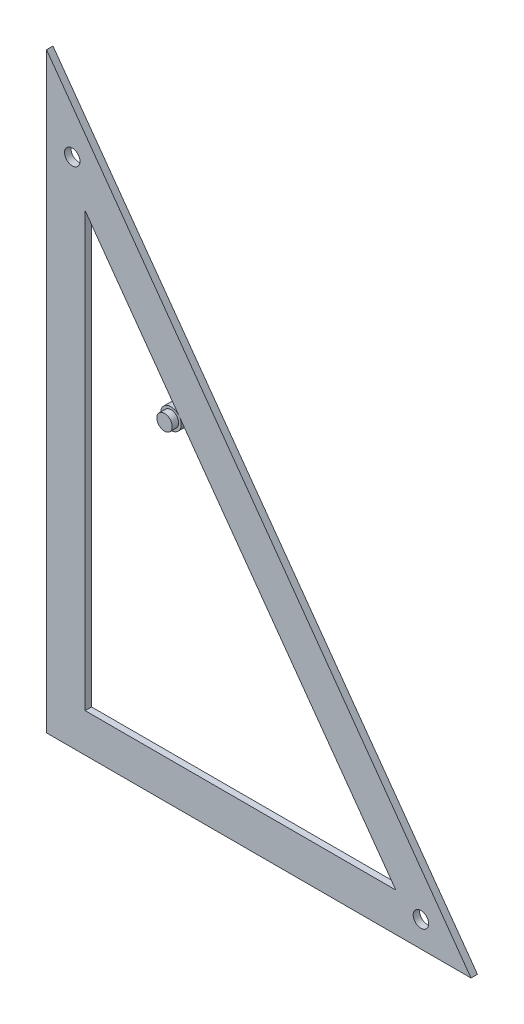
ISO-10303-21;
HEADER;
FILE_DESCRIPTION(('STEP AP214'),'2;1');
FILE_NAME('part.step','',(''),(''),'','','');
FILE_SCHEMA(('AUTOMOTIVE_DESIGN { 1 0 10303 214 1 1 1 1 }'));
ENDSEC;
DATA;
#1=APPLICATION_CONTEXT('core data for automotive mechanical design processes');
#2=APPLICATION_PROTOCOL_DEFINITION('international standard','automotive_design',2000,#1);
#3=PRODUCT_CONTEXT('',#1,'mechanical');
#4=PRODUCT('Part','Part','',(#3));
#5=PRODUCT_RELATED_PRODUCT_CATEGORY('part','',(#4));
#6=PRODUCT_DEFINITION_FORMATION('','',#4);
#7=PRODUCT_DEFINITION_CONTEXT('part definition',#1,'design');
#8=PRODUCT_DEFINITION('design','',#6,#7);
#9=PRODUCT_DEFINITION_SHAPE('','',#8);
#10=(LENGTH_UNIT() NAMED_UNIT(*) SI_UNIT(.MILLI.,.METRE.));
#11=(NAMED_UNIT(*) PLANE_ANGLE_UNIT() SI_UNIT($,.RADIAN.));
#12=(NAMED_UNIT(*) SI_UNIT($,.STERADIAN.) SOLID_ANGLE_UNIT());
#13=UNCERTAINTY_MEASURE_WITH_UNIT(LENGTH_MEASURE(1.E-05),#10,'distance_accuracy_value','');
#14=(GEOMETRIC_REPRESENTATION_CONTEXT(3) GLOBAL_UNCERTAINTY_ASSIGNED_CONTEXT((#13)) GLOBAL_UNIT_ASSIGNED_CONTEXT((#10,
#11,#12)) REPRESENTATION_CONTEXT('',''));
#15=CARTESIAN_POINT('',(0.,0.,0.));
#16=DIRECTION('',(0.,0.,1.));
#17=DIRECTION('',(1.,0.,0.));
#18=AXIS2_PLACEMENT_3D('',#15,#16,#17);
#19=CARTESIAN_POINT('',(96.7112317844096,260.,2.5));
#20=DIRECTION('',(0.,0.,-1.));
#21=DIRECTION('',(-1.,0.,0.));
#22=AXIS2_PLACEMENT_3D('',#19,#20,#21);
#23=CYLINDRICAL_SURFACE('',#22,8.00000000000001);
#24=CARTESIAN_POINT('',(96.7112317844096,260.,2.5));
#25=DIRECTION('',(0.,0.,1.));
#26=DIRECTION('',(1.,0.,0.));
#27=AXIS2_PLACEMENT_3D('',#24,#25,#26);
#28=CIRCLE('',#27,8.00000000000001);
#29=CARTESIAN_POINT('',(104.71123178441,260.,2.5));
#30=VERTEX_POINT('',#29);
#31=EDGE_CURVE('E49',#30,#30,#28,.T.);
#32=ORIENTED_EDGE('',*,*,#31,.F.);
#33=EDGE_LOOP('',(#32));
#34=FACE_BOUND('',#33,.T.);
#35=CARTESIAN_POINT('',(96.7112317844096,260.,-2.5));
#36=DIRECTION('',(0.,0.,1.));
#37=DIRECTION('',(1.,0.,0.));
#38=AXIS2_PLACEMENT_3D('',#35,#36,#37);
#39=CIRCLE('',#38,8.00000000000001);
#40=CARTESIAN_POINT('',(104.71123178441,260.,-2.5));
#41=VERTEX_POINT('',#40);
#42=EDGE_CURVE('E53',#41,#41,#39,.T.);
#43=ORIENTED_EDGE('',*,*,#42,.T.);
#44=EDGE_LOOP('',(#43));
#45=FACE_BOUND('',#44,.T.);
#46=ADVANCED_FACE('F43',(#34,#45),#23,.T.);
#47=CARTESIAN_POINT('',(96.7112317844096,260.,2.5));
#48=DIRECTION('',(0.,0.,1.));
#49=DIRECTION('',(1.,0.,0.));
#50=AXIS2_PLACEMENT_3D('',#47,#48,#49);
#51=PLANE('',#50);
#52=CARTESIAN_POINT('',(96.7112317844096,260.,2.5));
#53=DIRECTION('',(0.,0.,1.));
#54=DIRECTION('',(1.,0.,0.));
#55=AXIS2_PLACEMENT_3D('',#52,#53,#54);
#56=CIRCLE('',#55,6.);
#57=CARTESIAN_POINT('',(102.71123178441,260.,2.5));
#58=VERTEX_POINT('',#57);
#59=EDGE_CURVE('E58',#58,#58,#56,.F.);
#60=ORIENTED_EDGE('',*,*,#59,.T.);
#61=EDGE_LOOP('',(#60));
#62=FACE_BOUND('',#61,.T.);
#63=ORIENTED_EDGE('',*,*,#31,.T.);
#64=EDGE_LOOP('',(#63));
#65=FACE_BOUND('',#64,.T.);
#66=ADVANCED_FACE('F87',(#62,#65),#51,.T.);
#67=CARTESIAN_POINT('',(96.7112317844096,260.,-2.5));
#68=DIRECTION('',(0.,0.,1.));
#69=DIRECTION('',(1.,0.,0.));
#70=AXIS2_PLACEMENT_3D('',#67,#68,#69);
#71=PLANE('',#70);
#72=CARTESIAN_POINT('',(96.7112317844096,260.,-2.5));
#73=DIRECTION('',(0.,0.,1.));
#74=DIRECTION('',(1.,0.,0.));
#75=AXIS2_PLACEMENT_3D('',#72,#73,#74);
#76=CIRCLE('',#75,6.);
#77=CARTESIAN_POINT('',(102.71123178441,260.,-2.5));
#78=VERTEX_POINT('',#77);
#79=EDGE_CURVE('E11',#78,#78,#76,.F.);
#80=ORIENTED_EDGE('',*,*,#79,.F.);
#81=EDGE_LOOP('',(#80));
#82=FACE_BOUND('',#81,.T.);
#83=ORIENTED_EDGE('',*,*,#42,.F.);
#84=EDGE_LOOP('',(#83));
#85=FACE_BOUND('',#84,.T.);
#86=ADVANCED_FACE('F92',(#82,#85),#71,.F.);
#87=CARTESIAN_POINT('',(96.7112317844096,260.,-7.5));
#88=DIRECTION('',(0.,0.,1.));
#89=DIRECTION('',(1.,0.,0.));
#90=AXIS2_PLACEMENT_3D('',#87,#88,#89);
#91=PLANE('',#90);
#92=CARTESIAN_POINT('',(96.7112317844096,260.,-7.5));
#93=DIRECTION('',(0.,0.,1.));
#94=DIRECTION('',(1.,0.,0.));
#95=AXIS2_PLACEMENT_3D('',#92,#93,#94);
#96=CIRCLE('',#95,6.);
#97=CARTESIAN_POINT('',(102.71123178441,260.,-7.5));
#98=VERTEX_POINT('',#97);
#99=EDGE_CURVE('E63',#98,#98,#96,.T.);
#100=ORIENTED_EDGE('',*,*,#99,.F.);
#101=EDGE_LOOP('',(#100));
#102=FACE_BOUND('',#101,.T.);
#103=ADVANCED_FACE('F81',(#102),#91,.F.);
#104=CARTESIAN_POINT('',(96.7112317844096,260.,7.5));
#105=DIRECTION('',(0.,0.,-1.));
#106=DIRECTION('',(-1.,0.,0.));
#107=AXIS2_PLACEMENT_3D('',#104,#105,#106);
#108=CYLINDRICAL_SURFACE('',#107,6.);
#109=ORIENTED_EDGE('',*,*,#99,.T.);
#110=EDGE_LOOP('',(#109));
#111=FACE_BOUND('',#110,.T.);
#112=ORIENTED_EDGE('',*,*,#79,.T.);
#113=EDGE_LOOP('',(#112));
#114=FACE_BOUND('',#113,.T.);
#115=ADVANCED_FACE('F73',(#111,#114),#108,.T.);
#116=ORIENTED_EDGE('',*,*,#59,.F.);
#117=EDGE_LOOP('',(#116));
#118=FACE_BOUND('',#117,.T.);
#119=CARTESIAN_POINT('',(96.7112317844096,260.,7.5));
#120=DIRECTION('',(0.,0.,1.));
#121=DIRECTION('',(1.,0.,0.));
#122=AXIS2_PLACEMENT_3D('',#119,#120,#121);
#123=CIRCLE('',#122,6.);
#124=CARTESIAN_POINT('',(102.71123178441,260.,7.5));
#125=VERTEX_POINT('',#124);
#126=EDGE_CURVE('E62',#125,#125,#123,.T.);
#127=ORIENTED_EDGE('',*,*,#126,.F.);
#128=EDGE_LOOP('',(#127));
#129=FACE_BOUND('',#128,.T.);
#130=ADVANCED_FACE('F71',(#118,#129),#108,.T.);
#131=CARTESIAN_POINT('',(96.7112317844096,260.,7.5));
#132=DIRECTION('',(0.,0.,1.));
#133=DIRECTION('',(1.,0.,0.));
#134=AXIS2_PLACEMENT_3D('',#131,#132,#133);
#135=PLANE('',#134);
#136=ORIENTED_EDGE('',*,*,#126,.T.);
#137=EDGE_LOOP('',(#136));
#138=FACE_BOUND('',#137,.T.);
#139=ADVANCED_FACE('F69',(#138),#135,.T.);
#140=CLOSED_SHELL('',(#46,#66,#86,#103,#115,#130,#139));
#141=MANIFOLD_SOLID_BREP('B2',#140);
#142=CARTESIAN_POINT('',(0.,0.,2.5));
#143=DIRECTION('',(0.,0.,-1.));
#144=DIRECTION('',(-1.,0.,0.));
#145=AXIS2_PLACEMENT_3D('',#142,#143,#144);
#146=PLANE('',#145);
#147=DIRECTION('',(1.,0.,0.));
#148=VECTOR('',#147,1.);
#149=CARTESIAN_POINT('',(330.,0.,2.5));
#150=LINE('',#149,#148);
#151=CARTESIAN_POINT('',(0.,0.,2.5));
#152=VERTEX_POINT('',#151);
#153=CARTESIAN_POINT('',(330.,0.,2.5));
#154=VERTEX_POINT('',#153);
#155=EDGE_CURVE('E226',#152,#154,#150,.T.);
#156=ORIENTED_EDGE('',*,*,#155,.T.);
#157=DIRECTION('',(-0.582907875451731,0.812538250629685,0.));
#158=VECTOR('',#157,1.);
#159=CARTESIAN_POINT('',(0.,460.,2.5));
#160=LINE('',#159,#158);
#161=CARTESIAN_POINT('',(0.,460.,2.5));
#162=VERTEX_POINT('',#161);
#163=EDGE_CURVE('E229',#154,#162,#160,.T.);
#164=ORIENTED_EDGE('',*,*,#163,.T.);
#165=DIRECTION('',(0.,-1.,0.));
#166=VECTOR('',#165,1.);
#167=CARTESIAN_POINT('',(0.,0.,2.5));
#168=LINE('',#167,#166);
#169=EDGE_CURVE('E232',#162,#152,#168,.T.);
#170=ORIENTED_EDGE('',*,*,#169,.T.);
#171=EDGE_LOOP('',(#156,#164,#170));
#172=FACE_BOUND('',#171,.T.);
#173=DIRECTION('',(1.,0.,0.));
#174=VECTOR('',#173,1.);
#175=CARTESIAN_POINT('',(271.556922118127,30.,2.5));
#176=LINE('',#175,#174);
#177=CARTESIAN_POINT('',(30.,30.,2.5));
#178=VERTEX_POINT('',#177);
#179=CARTESIAN_POINT('',(271.556922118127,30.,2.5));
#180=VERTEX_POINT('',#179);
#181=EDGE_CURVE('E196',#178,#180,#176,.T.);
#182=ORIENTED_EDGE('',*,*,#181,.F.);
#183=DIRECTION('',(0.,-1.,0.));
#184=VECTOR('',#183,1.);
#185=CARTESIAN_POINT('',(30.,30.,2.5));
#186=LINE('',#185,#184);
#187=CARTESIAN_POINT('',(30.,366.715709619207,2.5));
#188=VERTEX_POINT('',#187);
#189=EDGE_CURVE('E214',#188,#178,#186,.T.);
#190=ORIENTED_EDGE('',*,*,#189,.F.);
#191=DIRECTION('',(-0.582907875451731,0.812538250629685,0.));
#192=VECTOR('',#191,1.);
#193=CARTESIAN_POINT('',(30.,366.715709619207,2.5));
#194=LINE('',#193,#192);
#195=EDGE_CURVE('E204',#180,#188,#194,.T.);
#196=ORIENTED_EDGE('',*,*,#195,.F.);
#197=EDGE_LOOP('',(#182,#190,#196));
#198=FACE_BOUND('',#197,.T.);
#199=CARTESIAN_POINT('',(20.,397.810473079471,2.5));
#200=DIRECTION('',(0.,0.,1.));
#201=DIRECTION('',(1.,0.,0.));
#202=AXIS2_PLACEMENT_3D('',#199,#200,#201);
#203=CIRCLE('',#202,6.);
#204=CARTESIAN_POINT('',(26.,397.810473079471,2.5));
#205=VERTEX_POINT('',#204);
#206=EDGE_CURVE('E220',#205,#205,#203,.T.);
#207=ORIENTED_EDGE('',*,*,#206,.F.);
#208=EDGE_LOOP('',(#207));
#209=FACE_BOUND('',#208,.T.);
#210=CARTESIAN_POINT('',(291.037948078751,20.0000000000001,2.5));
#211=DIRECTION('',(0.,0.,1.));
#212=DIRECTION('',(1.,0.,0.));
#213=AXIS2_PLACEMENT_3D('',#210,#211,#212);
#214=CIRCLE('',#213,5.99999999999999);
#215=CARTESIAN_POINT('',(297.037948078751,20.0000000000001,2.5));
#216=VERTEX_POINT('',#215);
#217=EDGE_CURVE('E291',#216,#216,#214,.T.);
#218=ORIENTED_EDGE('',*,*,#217,.F.);
#219=EDGE_LOOP('',(#218));
#220=FACE_BOUND('',#219,.T.);
#221=ADVANCED_FACE('F143',(#172,#198,#209,#220),#146,.F.);
#222=CARTESIAN_POINT('',(0.,0.,-2.5));
#223=DIRECTION('',(0.,0.,-1.));
#224=DIRECTION('',(-1.,0.,0.));
#225=AXIS2_PLACEMENT_3D('',#222,#223,#224);
#226=PLANE('',#225);
#227=CARTESIAN_POINT('',(20.,397.810473079471,-2.5));
#228=DIRECTION('',(0.,0.,1.));
#229=DIRECTION('',(1.,0.,0.));
#230=AXIS2_PLACEMENT_3D('',#227,#228,#229);
#231=CIRCLE('',#230,6.);
#232=CARTESIAN_POINT('',(26.,397.810473079471,-2.5));
#233=VERTEX_POINT('',#232);
#234=EDGE_CURVE('E297',#233,#233,#231,.T.);
#235=ORIENTED_EDGE('',*,*,#234,.T.);
#236=EDGE_LOOP('',(#235));
#237=FACE_BOUND('',#236,.T.);
#238=DIRECTION('',(1.,0.,0.));
#239=VECTOR('',#238,1.);
#240=CARTESIAN_POINT('',(330.,0.,-2.5));
#241=LINE('',#240,#239);
#242=CARTESIAN_POINT('',(0.,0.,-2.5));
#243=VERTEX_POINT('',#242);
#244=CARTESIAN_POINT('',(330.,0.,-2.5));
#245=VERTEX_POINT('',#244);
#246=EDGE_CURVE('E211',#243,#245,#241,.T.);
#247=ORIENTED_EDGE('',*,*,#246,.F.);
#248=DIRECTION('',(0.,-1.,0.));
#249=VECTOR('',#248,1.);
#250=CARTESIAN_POINT('',(0.,0.,-2.5));
#251=LINE('',#250,#249);
#252=CARTESIAN_POINT('',(0.,460.,-2.5));
#253=VERTEX_POINT('',#252);
#254=EDGE_CURVE('E230',#253,#243,#251,.T.);
#255=ORIENTED_EDGE('',*,*,#254,.F.);
#256=DIRECTION('',(-0.582907875451731,0.812538250629685,0.));
#257=VECTOR('',#256,1.);
#258=CARTESIAN_POINT('',(0.,460.,-2.5));
#259=LINE('',#258,#257);
#260=EDGE_CURVE('E237',#245,#253,#259,.T.);
#261=ORIENTED_EDGE('',*,*,#260,.F.);
#262=EDGE_LOOP('',(#247,#255,#261));
#263=FACE_BOUND('',#262,.T.);
#264=DIRECTION('',(0.,-1.,0.));
#265=VECTOR('',#264,1.);
#266=CARTESIAN_POINT('',(30.,30.,-2.5));
#267=LINE('',#266,#265);
#268=CARTESIAN_POINT('',(30.,366.715709619207,-2.5));
#269=VERTEX_POINT('',#268);
#270=CARTESIAN_POINT('',(30.,30.,-2.5));
#271=VERTEX_POINT('',#270);
#272=EDGE_CURVE('E205',#269,#271,#267,.T.);
#273=ORIENTED_EDGE('',*,*,#272,.T.);
#274=DIRECTION('',(1.,0.,0.));
#275=VECTOR('',#274,1.);
#276=CARTESIAN_POINT('',(271.556922118127,30.,-2.5));
#277=LINE('',#276,#275);
#278=CARTESIAN_POINT('',(271.556922118127,30.,-2.5));
#279=VERTEX_POINT('',#278);
#280=EDGE_CURVE('E166',#271,#279,#277,.T.);
#281=ORIENTED_EDGE('',*,*,#280,.T.);
#282=DIRECTION('',(-0.582907875451731,0.812538250629685,0.));
#283=VECTOR('',#282,1.);
#284=CARTESIAN_POINT('',(30.,366.715709619207,-2.5));
#285=LINE('',#284,#283);
#286=EDGE_CURVE('E210',#279,#269,#285,.T.);
#287=ORIENTED_EDGE('',*,*,#286,.T.);
#288=EDGE_LOOP('',(#273,#281,#287));
#289=FACE_BOUND('',#288,.T.);
#290=CARTESIAN_POINT('',(291.037948078751,20.0000000000001,-2.5));
#291=DIRECTION('',(0.,0.,1.));
#292=DIRECTION('',(1.,0.,0.));
#293=AXIS2_PLACEMENT_3D('',#290,#291,#292);
#294=CIRCLE('',#293,5.99999999999999);
#295=CARTESIAN_POINT('',(297.037948078751,20.0000000000001,-2.5));
#296=VERTEX_POINT('',#295);
#297=EDGE_CURVE('E294',#296,#296,#294,.T.);
#298=ORIENTED_EDGE('',*,*,#297,.T.);
#299=EDGE_LOOP('',(#298));
#300=FACE_BOUND('',#299,.T.);
#301=ADVANCED_FACE('F251',(#237,#263,#289,#300),#226,.T.);
#302=CARTESIAN_POINT('',(330.,0.,2.5));
#303=DIRECTION('',(0.,1.,0.));
#304=DIRECTION('',(-1.,0.,0.));
#305=AXIS2_PLACEMENT_3D('',#302,#303,#304);
#306=PLANE('',#305);
#307=ORIENTED_EDGE('',*,*,#246,.T.);
#308=DIRECTION('',(0.,0.,-1.));
#309=VECTOR('',#308,1.);
#310=CARTESIAN_POINT('',(330.,0.,2.5));
#311=LINE('',#310,#309);
#312=EDGE_CURVE('E41',#154,#245,#311,.T.);
#313=ORIENTED_EDGE('',*,*,#312,.F.);
#314=ORIENTED_EDGE('',*,*,#155,.F.);
#315=DIRECTION('',(0.,0.,-1.));
#316=VECTOR('',#315,1.);
#317=CARTESIAN_POINT('',(0.,0.,2.5));
#318=LINE('',#317,#316);
#319=EDGE_CURVE('E234',#152,#243,#318,.T.);
#320=ORIENTED_EDGE('',*,*,#319,.T.);
#321=EDGE_LOOP('',(#307,#313,#314,#320));
#322=FACE_BOUND('',#321,.T.);
#323=ADVANCED_FACE('F145',(#322),#306,.F.);
#324=CARTESIAN_POINT('',(0.,460.,2.5));
#325=DIRECTION('',(-0.812538250629685,-0.582907875451731,0.));
#326=DIRECTION('',(0.582907875451731,-0.812538250629685,0.));
#327=AXIS2_PLACEMENT_3D('',#324,#325,#326);
#328=PLANE('',#327);
#329=ORIENTED_EDGE('',*,*,#260,.T.);
#330=DIRECTION('',(0.,0.,-1.));
#331=VECTOR('',#330,1.);
#332=CARTESIAN_POINT('',(0.,460.,2.5));
#333=LINE('',#332,#331);
#334=EDGE_CURVE('E151',#162,#253,#333,.T.);
#335=ORIENTED_EDGE('',*,*,#334,.F.);
#336=ORIENTED_EDGE('',*,*,#163,.F.);
#337=ORIENTED_EDGE('',*,*,#312,.T.);
#338=EDGE_LOOP('',(#329,#335,#336,#337));
#339=FACE_BOUND('',#338,.T.);
#340=ADVANCED_FACE('F257',(#339),#328,.F.);
#341=CARTESIAN_POINT('',(0.,0.,2.5));
#342=DIRECTION('',(1.,0.,0.));
#343=DIRECTION('',(0.,0.,-1.));
#344=AXIS2_PLACEMENT_3D('',#341,#342,#343);
#345=PLANE('',#344);
#346=ORIENTED_EDGE('',*,*,#254,.T.);
#347=ORIENTED_EDGE('',*,*,#319,.F.);
#348=ORIENTED_EDGE('',*,*,#169,.F.);
#349=ORIENTED_EDGE('',*,*,#334,.T.);
#350=EDGE_LOOP('',(#346,#347,#348,#349));
#351=FACE_BOUND('',#350,.T.);
#352=ADVANCED_FACE('F246',(#351),#345,.F.);
#353=CARTESIAN_POINT('',(271.556922118127,30.,2.5));
#354=DIRECTION('',(0.,1.,0.));
#355=DIRECTION('',(0.,0.,1.));
#356=AXIS2_PLACEMENT_3D('',#353,#354,#355);
#357=PLANE('',#356);
#358=ORIENTED_EDGE('',*,*,#280,.F.);
#359=DIRECTION('',(0.,0.,-1.));
#360=VECTOR('',#359,1.);
#361=CARTESIAN_POINT('',(30.,30.,2.5));
#362=LINE('',#361,#360);
#363=EDGE_CURVE('E200',#178,#271,#362,.T.);
#364=ORIENTED_EDGE('',*,*,#363,.F.);
#365=ORIENTED_EDGE('',*,*,#181,.T.);
#366=DIRECTION('',(0.,0.,-1.));
#367=VECTOR('',#366,1.);
#368=CARTESIAN_POINT('',(271.556922118127,30.,2.5));
#369=LINE('',#368,#367);
#370=EDGE_CURVE('E199',#180,#279,#369,.T.);
#371=ORIENTED_EDGE('',*,*,#370,.T.);
#372=EDGE_LOOP('',(#358,#364,#365,#371));
#373=FACE_BOUND('',#372,.T.);
#374=ADVANCED_FACE('F198',(#373),#357,.T.);
#375=CARTESIAN_POINT('',(30.,366.715709619207,2.5));
#376=DIRECTION('',(-0.812538250629685,-0.582907875451731,0.));
#377=DIRECTION('',(0.582907875451731,-0.812538250629685,0.));
#378=AXIS2_PLACEMENT_3D('',#375,#376,#377);
#379=PLANE('',#378);
#380=ORIENTED_EDGE('',*,*,#286,.F.);
#381=ORIENTED_EDGE('',*,*,#370,.F.);
#382=ORIENTED_EDGE('',*,*,#195,.T.);
#383=DIRECTION('',(0.,0.,-1.));
#384=VECTOR('',#383,1.);
#385=CARTESIAN_POINT('',(30.,366.715709619207,2.5));
#386=LINE('',#385,#384);
#387=EDGE_CURVE('E158',#188,#269,#386,.T.);
#388=ORIENTED_EDGE('',*,*,#387,.T.);
#389=EDGE_LOOP('',(#380,#381,#382,#388));
#390=FACE_BOUND('',#389,.T.);
#391=ADVANCED_FACE('F208',(#390),#379,.T.);
#392=CARTESIAN_POINT('',(30.,30.,2.5));
#393=DIRECTION('',(1.,0.,0.));
#394=DIRECTION('',(0.,1.,0.));
#395=AXIS2_PLACEMENT_3D('',#392,#393,#394);
#396=PLANE('',#395);
#397=ORIENTED_EDGE('',*,*,#272,.F.);
#398=ORIENTED_EDGE('',*,*,#387,.F.);
#399=ORIENTED_EDGE('',*,*,#189,.T.);
#400=ORIENTED_EDGE('',*,*,#363,.T.);
#401=EDGE_LOOP('',(#397,#398,#399,#400));
#402=FACE_BOUND('',#401,.T.);
#403=ADVANCED_FACE('F276',(#402),#396,.T.);
#404=CARTESIAN_POINT('',(20.,397.810473079471,2.5));
#405=DIRECTION('',(0.,0.,-1.));
#406=DIRECTION('',(-1.,0.,0.));
#407=AXIS2_PLACEMENT_3D('',#404,#405,#406);
#408=CYLINDRICAL_SURFACE('',#407,6.);
#409=ORIENTED_EDGE('',*,*,#206,.T.);
#410=EDGE_LOOP('',(#409));
#411=FACE_BOUND('',#410,.T.);
#412=ORIENTED_EDGE('',*,*,#234,.F.);
#413=EDGE_LOOP('',(#412));
#414=FACE_BOUND('',#413,.T.);
#415=ADVANCED_FACE('F279',(#411,#414),#408,.F.);
#416=CARTESIAN_POINT('',(291.037948078751,20.0000000000001,2.5));
#417=DIRECTION('',(0.,0.,-1.));
#418=DIRECTION('',(-1.,0.,0.));
#419=AXIS2_PLACEMENT_3D('',#416,#417,#418);
#420=CYLINDRICAL_SURFACE('',#419,5.99999999999999);
#421=ORIENTED_EDGE('',*,*,#217,.T.);
#422=EDGE_LOOP('',(#421));
#423=FACE_BOUND('',#422,.T.);
#424=ORIENTED_EDGE('',*,*,#297,.F.);
#425=EDGE_LOOP('',(#424));
#426=FACE_BOUND('',#425,.T.);
#427=ADVANCED_FACE('F282',(#423,#426),#420,.F.);
#428=CLOSED_SHELL('',(#221,#301,#323,#340,#352,#374,#391,#403,#415,#427));
#429=MANIFOLD_SOLID_BREP('B6',#428);
#430=ADVANCED_BREP_SHAPE_REPRESENTATION('',(#18,#141,#429),#14);
#431=SHAPE_DEFINITION_REPRESENTATION(#9,#430);
ENDSEC;
END-ISO-10303-21;
